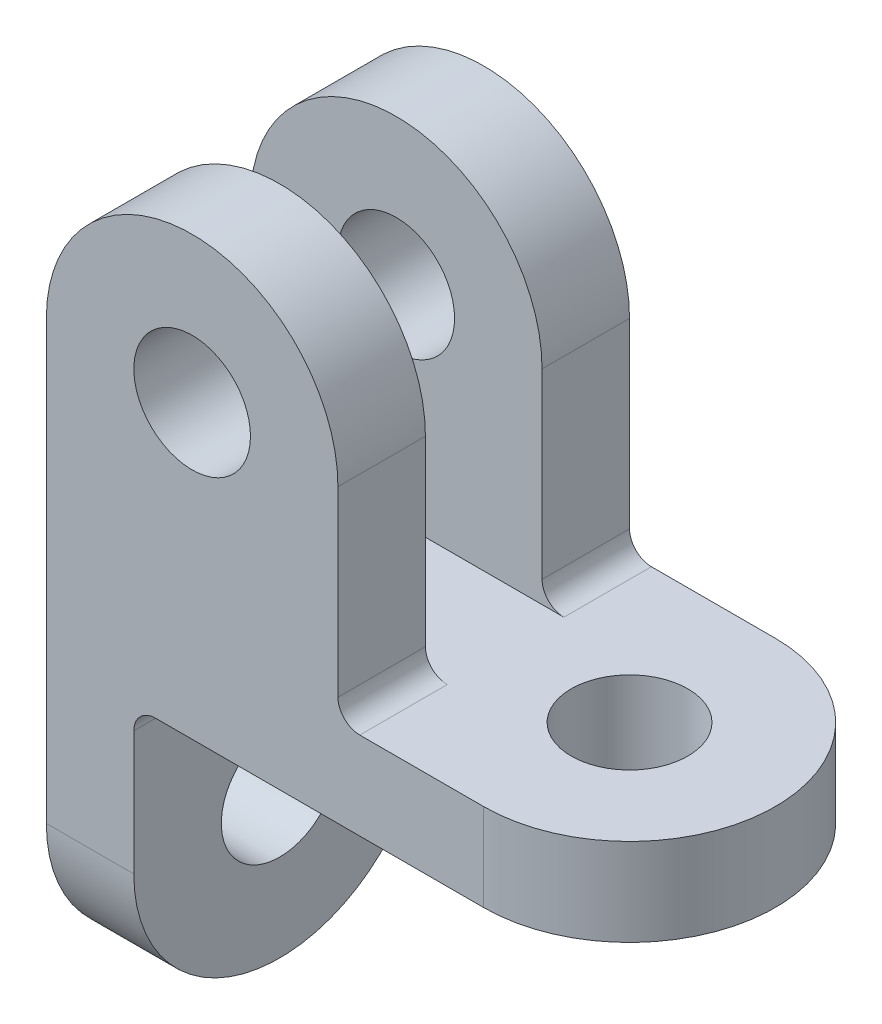
ISO-10303-21;
HEADER;
FILE_DESCRIPTION(('STEP AP214'),'2;1');
FILE_NAME('part.step','',(''),(''),'','','');
FILE_SCHEMA(('AUTOMOTIVE_DESIGN { 1 0 10303 214 1 1 1 1 }'));
ENDSEC;
DATA;
#1=APPLICATION_CONTEXT('core data for automotive mechanical design processes');
#2=APPLICATION_PROTOCOL_DEFINITION('international standard','automotive_design',2000,#1);
#3=PRODUCT_CONTEXT('',#1,'mechanical');
#4=PRODUCT('Part','Part','',(#3));
#5=PRODUCT_RELATED_PRODUCT_CATEGORY('part','',(#4));
#6=PRODUCT_DEFINITION_FORMATION('','',#4);
#7=PRODUCT_DEFINITION_CONTEXT('part definition',#1,'design');
#8=PRODUCT_DEFINITION('design','',#6,#7);
#9=PRODUCT_DEFINITION_SHAPE('','',#8);
#10=(LENGTH_UNIT() NAMED_UNIT(*) SI_UNIT(.MILLI.,.METRE.));
#11=(NAMED_UNIT(*) PLANE_ANGLE_UNIT() SI_UNIT($,.RADIAN.));
#12=(NAMED_UNIT(*) SI_UNIT($,.STERADIAN.) SOLID_ANGLE_UNIT());
#13=UNCERTAINTY_MEASURE_WITH_UNIT(LENGTH_MEASURE(1.E-05),#10,'distance_accuracy_value','');
#14=(GEOMETRIC_REPRESENTATION_CONTEXT(3) GLOBAL_UNCERTAINTY_ASSIGNED_CONTEXT((#13)) GLOBAL_UNIT_ASSIGNED_CONTEXT((#10,
#11,#12)) REPRESENTATION_CONTEXT('',''));
#15=CARTESIAN_POINT('',(0.,0.,0.));
#16=DIRECTION('',(0.,0.,1.));
#17=DIRECTION('',(1.,0.,0.));
#18=AXIS2_PLACEMENT_3D('',#15,#16,#17);
#19=CARTESIAN_POINT('',(-6.52307692307691,12.,40.));
#20=DIRECTION('',(-1.,0.,0.));
#21=DIRECTION('',(0.,-1.,0.));
#22=AXIS2_PLACEMENT_3D('',#19,#20,#21);
#23=PLANE('',#22);
#24=DIRECTION('',(0.,1.,0.));
#25=VECTOR('',#24,1.);
#26=CARTESIAN_POINT('',(-6.52307692307691,12.,40.));
#27=LINE('',#26,#25);
#28=CARTESIAN_POINT('',(-6.52307692307691,15.,40.));
#29=VERTEX_POINT('',#28);
#30=CARTESIAN_POINT('',(-6.52307692307692,40.,40.));
#31=VERTEX_POINT('',#30);
#32=EDGE_CURVE('E223',#29,#31,#27,.T.);
#33=ORIENTED_EDGE('',*,*,#32,.F.);
#34=DIRECTION('',(0.,0.,-1.));
#35=VECTOR('',#34,1.);
#36=CARTESIAN_POINT('',(-6.52307692307691,15.,28.));
#37=LINE('',#36,#35);
#38=CARTESIAN_POINT('',(-6.52307692307691,15.,28.));
#39=VERTEX_POINT('',#38);
#40=EDGE_CURVE('E263',#29,#39,#37,.T.);
#41=ORIENTED_EDGE('',*,*,#40,.T.);
#42=DIRECTION('',(0.,-1.,0.));
#43=VECTOR('',#42,1.);
#44=CARTESIAN_POINT('',(-6.52307692307691,12.,28.));
#45=LINE('',#44,#43);
#46=CARTESIAN_POINT('',(-6.52307692307692,40.,28.));
#47=VERTEX_POINT('',#46);
#48=EDGE_CURVE('E276',#47,#39,#45,.T.);
#49=ORIENTED_EDGE('',*,*,#48,.F.);
#50=DIRECTION('',(0.,0.,-1.));
#51=VECTOR('',#50,1.);
#52=CARTESIAN_POINT('',(-6.52307692307692,40.,40.));
#53=LINE('',#52,#51);
#54=EDGE_CURVE('E245',#31,#47,#53,.T.);
#55=ORIENTED_EDGE('',*,*,#54,.F.);
#56=EDGE_LOOP('',(#33,#41,#49,#55));
#57=FACE_BOUND('',#56,.T.);
#58=ADVANCED_FACE('F33',(#57),#23,.F.);
#59=CARTESIAN_POINT('',(-26.5230769230769,40.,0.));
#60=DIRECTION('',(0.,0.,1.));
#61=DIRECTION('',(1.,0.,0.));
#62=AXIS2_PLACEMENT_3D('',#59,#60,#61);
#63=CYLINDRICAL_SURFACE('',#62,20.);
#64=CARTESIAN_POINT('',(-26.5230769230769,40.,28.));
#65=DIRECTION('',(0.,0.,1.));
#66=DIRECTION('',(1.,0.,0.));
#67=AXIS2_PLACEMENT_3D('',#64,#65,#66);
#68=CIRCLE('',#67,20.);
#69=CARTESIAN_POINT('',(-46.5230769230769,40.,28.));
#70=VERTEX_POINT('',#69);
#71=EDGE_CURVE('E172',#70,#47,#68,.F.);
#72=ORIENTED_EDGE('',*,*,#71,.F.);
#73=DIRECTION('',(0.,0.,-1.));
#74=VECTOR('',#73,1.);
#75=CARTESIAN_POINT('',(-46.5230769230769,40.,40.));
#76=LINE('',#75,#74);
#77=CARTESIAN_POINT('',(-46.5230769230769,40.,40.));
#78=VERTEX_POINT('',#77);
#79=EDGE_CURVE('E242',#78,#70,#76,.T.);
#80=ORIENTED_EDGE('',*,*,#79,.F.);
#81=CARTESIAN_POINT('',(-26.5230769230769,40.,40.));
#82=DIRECTION('',(0.,0.,1.));
#83=DIRECTION('',(1.,0.,0.));
#84=AXIS2_PLACEMENT_3D('',#81,#82,#83);
#85=CIRCLE('',#84,20.);
#86=EDGE_CURVE('E177',#31,#78,#85,.T.);
#87=ORIENTED_EDGE('',*,*,#86,.F.);
#88=ORIENTED_EDGE('',*,*,#54,.T.);
#89=EDGE_LOOP('',(#72,#80,#87,#88));
#90=FACE_BOUND('',#89,.T.);
#91=ADVANCED_FACE('F313',(#90),#63,.T.);
#92=CARTESIAN_POINT('',(-26.5230769230769,40.,0.));
#93=DIRECTION('',(0.,0.,1.));
#94=DIRECTION('',(1.,0.,0.));
#95=AXIS2_PLACEMENT_3D('',#92,#93,#94);
#96=CYLINDRICAL_SURFACE('',#95,8.);
#97=CARTESIAN_POINT('',(-26.5230769230769,40.,28.));
#98=DIRECTION('',(0.,0.,1.));
#99=DIRECTION('',(1.,0.,0.));
#100=AXIS2_PLACEMENT_3D('',#97,#98,#99);
#101=CIRCLE('',#100,8.);
#102=CARTESIAN_POINT('',(-18.5230769230769,40.,28.));
#103=VERTEX_POINT('',#102);
#104=EDGE_CURVE('E149',#103,#103,#101,.F.);
#105=ORIENTED_EDGE('',*,*,#104,.T.);
#106=EDGE_LOOP('',(#105));
#107=FACE_BOUND('',#106,.T.);
#108=CARTESIAN_POINT('',(-26.5230769230769,40.,40.));
#109=DIRECTION('',(0.,0.,1.));
#110=DIRECTION('',(1.,0.,0.));
#111=AXIS2_PLACEMENT_3D('',#108,#109,#110);
#112=CIRCLE('',#111,8.);
#113=CARTESIAN_POINT('',(-18.5230769230769,40.,40.));
#114=VERTEX_POINT('',#113);
#115=EDGE_CURVE('E167',#114,#114,#112,.T.);
#116=ORIENTED_EDGE('',*,*,#115,.T.);
#117=EDGE_LOOP('',(#116));
#118=FACE_BOUND('',#117,.T.);
#119=ADVANCED_FACE('F333',(#107,#118),#96,.F.);
#120=CARTESIAN_POINT('',(-46.5230769230769,40.,40.));
#121=DIRECTION('',(1.,0.,0.));
#122=DIRECTION('',(0.,0.,-1.));
#123=AXIS2_PLACEMENT_3D('',#120,#121,#122);
#124=PLANE('',#123);
#125=ORIENTED_EDGE('',*,*,#79,.T.);
#126=DIRECTION('',(0.,-1.,0.));
#127=VECTOR('',#126,1.);
#128=CARTESIAN_POINT('',(-46.5230769230769,40.,28.));
#129=LINE('',#128,#127);
#130=CARTESIAN_POINT('',(-46.5230769230769,12.,28.));
#131=VERTEX_POINT('',#130);
#132=EDGE_CURVE('E166',#70,#131,#129,.T.);
#133=ORIENTED_EDGE('',*,*,#132,.T.);
#134=DIRECTION('',(0.,0.,-1.));
#135=VECTOR('',#134,1.);
#136=CARTESIAN_POINT('',(-46.5230769230769,12.,40.));
#137=LINE('',#136,#135);
#138=CARTESIAN_POINT('',(-46.5230769230769,12.,12.));
#139=VERTEX_POINT('',#138);
#140=EDGE_CURVE('E154',#131,#139,#137,.T.);
#141=ORIENTED_EDGE('',*,*,#140,.T.);
#142=DIRECTION('',(0.,1.,0.));
#143=VECTOR('',#142,1.);
#144=CARTESIAN_POINT('',(-46.5230769230769,40.,12.));
#145=LINE('',#144,#143);
#146=CARTESIAN_POINT('',(-46.5230769230769,40.,12.));
#147=VERTEX_POINT('',#146);
#148=EDGE_CURVE('E139',#139,#147,#145,.T.);
#149=ORIENTED_EDGE('',*,*,#148,.T.);
#150=CARTESIAN_POINT('',(-46.5230769230769,40.,0.));
#151=VERTEX_POINT('',#150);
#152=EDGE_CURVE('E225',#147,#151,#76,.T.);
#153=ORIENTED_EDGE('',*,*,#152,.T.);
#154=DIRECTION('',(0.,-1.,0.));
#155=VECTOR('',#154,1.);
#156=CARTESIAN_POINT('',(-46.5230769230769,40.,0.));
#157=LINE('',#156,#155);
#158=CARTESIAN_POINT('',(-46.5230769230769,-20.,0.));
#159=VERTEX_POINT('',#158);
#160=EDGE_CURVE('E206',#151,#159,#157,.T.);
#161=ORIENTED_EDGE('',*,*,#160,.T.);
#162=CARTESIAN_POINT('',(-46.5230769230769,-20.,20.));
#163=DIRECTION('',(1.,0.,0.));
#164=DIRECTION('',(0.,0.,-1.));
#165=AXIS2_PLACEMENT_3D('',#162,#163,#164);
#166=CIRCLE('',#165,20.);
#167=CARTESIAN_POINT('',(-46.5230769230769,-20.,40.));
#168=VERTEX_POINT('',#167);
#169=EDGE_CURVE('E203',#168,#159,#166,.T.);
#170=ORIENTED_EDGE('',*,*,#169,.F.);
#171=DIRECTION('',(0.,-1.,0.));
#172=VECTOR('',#171,1.);
#173=CARTESIAN_POINT('',(-46.5230769230769,40.,40.));
#174=LINE('',#173,#172);
#175=EDGE_CURVE('E209',#78,#168,#174,.T.);
#176=ORIENTED_EDGE('',*,*,#175,.F.);
#177=EDGE_LOOP('',(#125,#133,#141,#149,#153,#161,#170,#176));
#178=FACE_BOUND('',#177,.T.);
#179=CARTESIAN_POINT('',(-46.5230769230769,-20.,20.));
#180=DIRECTION('',(1.,0.,0.));
#181=DIRECTION('',(0.,0.,-1.));
#182=AXIS2_PLACEMENT_3D('',#179,#180,#181);
#183=CIRCLE('',#182,8.);
#184=CARTESIAN_POINT('',(-46.5230769230769,-20.,12.));
#185=VERTEX_POINT('',#184);
#186=EDGE_CURVE('E199',#185,#185,#183,.F.);
#187=ORIENTED_EDGE('',*,*,#186,.F.);
#188=EDGE_LOOP('',(#187));
#189=FACE_BOUND('',#188,.T.);
#190=ADVANCED_FACE('F164',(#178,#189),#124,.F.);
#191=CARTESIAN_POINT('',(-34.5230769230769,-20.,40.));
#192=DIRECTION('',(-1.,0.,0.));
#193=DIRECTION('',(0.,0.,1.));
#194=AXIS2_PLACEMENT_3D('',#191,#192,#193);
#195=PLANE('',#194);
#196=CARTESIAN_POINT('',(-34.5230769230769,-20.,20.));
#197=DIRECTION('',(1.,0.,0.));
#198=DIRECTION('',(0.,0.,-1.));
#199=AXIS2_PLACEMENT_3D('',#196,#197,#198);
#200=CIRCLE('',#199,8.);
#201=CARTESIAN_POINT('',(-34.5230769230769,-20.,12.));
#202=VERTEX_POINT('',#201);
#203=EDGE_CURVE('E194',#202,#202,#200,.T.);
#204=ORIENTED_EDGE('',*,*,#203,.F.);
#205=EDGE_LOOP('',(#204));
#206=FACE_BOUND('',#205,.T.);
#207=DIRECTION('',(0.,1.,0.));
#208=VECTOR('',#207,1.);
#209=CARTESIAN_POINT('',(-34.5230769230769,-20.,0.));
#210=LINE('',#209,#208);
#211=CARTESIAN_POINT('',(-34.5230769230769,-20.,0.));
#212=VERTEX_POINT('',#211);
#213=CARTESIAN_POINT('',(-34.5230769230769,-3.00000000000001,0.));
#214=VERTEX_POINT('',#213);
#215=EDGE_CURVE('E231',#212,#214,#210,.T.);
#216=ORIENTED_EDGE('',*,*,#215,.T.);
#217=DIRECTION('',(0.,0.,-1.));
#218=VECTOR('',#217,1.);
#219=CARTESIAN_POINT('',(-34.5230769230769,-3.,40.));
#220=LINE('',#219,#218);
#221=CARTESIAN_POINT('',(-34.5230769230769,-3.00000000000001,40.));
#222=VERTEX_POINT('',#221);
#223=EDGE_CURVE('E255',#214,#222,#220,.F.);
#224=ORIENTED_EDGE('',*,*,#223,.T.);
#225=DIRECTION('',(0.,1.,0.));
#226=VECTOR('',#225,1.);
#227=CARTESIAN_POINT('',(-34.5230769230769,-20.,40.));
#228=LINE('',#227,#226);
#229=CARTESIAN_POINT('',(-34.5230769230769,-20.,40.));
#230=VERTEX_POINT('',#229);
#231=EDGE_CURVE('E214',#230,#222,#228,.T.);
#232=ORIENTED_EDGE('',*,*,#231,.F.);
#233=CARTESIAN_POINT('',(-34.5230769230769,-20.,20.));
#234=DIRECTION('',(1.,0.,0.));
#235=DIRECTION('',(0.,0.,-1.));
#236=AXIS2_PLACEMENT_3D('',#233,#234,#235);
#237=CIRCLE('',#236,20.);
#238=EDGE_CURVE('E202',#230,#212,#237,.T.);
#239=ORIENTED_EDGE('',*,*,#238,.T.);
#240=EDGE_LOOP('',(#216,#224,#232,#239));
#241=FACE_BOUND('',#240,.T.);
#242=ADVANCED_FACE('F354',(#206,#241),#195,.F.);
#243=CARTESIAN_POINT('',(-34.5230769230769,0.,40.));
#244=DIRECTION('',(0.,1.,0.));
#245=DIRECTION('',(0.,0.,1.));
#246=AXIS2_PLACEMENT_3D('',#243,#244,#245);
#247=PLANE('',#246);
#248=CARTESIAN_POINT('',(13.4769230769231,0.,20.));
#249=DIRECTION('',(0.,1.,0.));
#250=DIRECTION('',(-1.,0.,0.));
#251=AXIS2_PLACEMENT_3D('',#248,#249,#250);
#252=CIRCLE('',#251,8.);
#253=CARTESIAN_POINT('',(5.47692307692308,0.,20.));
#254=VERTEX_POINT('',#253);
#255=EDGE_CURVE('E185',#254,#254,#252,.T.);
#256=ORIENTED_EDGE('',*,*,#255,.T.);
#257=EDGE_LOOP('',(#256));
#258=FACE_BOUND('',#257,.T.);
#259=DIRECTION('',(1.,0.,0.));
#260=VECTOR('',#259,1.);
#261=CARTESIAN_POINT('',(-34.5230769230769,0.,40.));
#262=LINE('',#261,#260);
#263=CARTESIAN_POINT('',(-31.5230769230769,0.,40.));
#264=VERTEX_POINT('',#263);
#265=CARTESIAN_POINT('',(13.4769230769231,0.,40.));
#266=VERTEX_POINT('',#265);
#267=EDGE_CURVE('E217',#264,#266,#262,.T.);
#268=ORIENTED_EDGE('',*,*,#267,.F.);
#269=DIRECTION('',(0.,0.,-1.));
#270=VECTOR('',#269,1.);
#271=CARTESIAN_POINT('',(-31.5230769230769,0.,0.));
#272=LINE('',#271,#270);
#273=CARTESIAN_POINT('',(-31.5230769230769,0.,0.));
#274=VERTEX_POINT('',#273);
#275=EDGE_CURVE('E248',#264,#274,#272,.T.);
#276=ORIENTED_EDGE('',*,*,#275,.T.);
#277=DIRECTION('',(1.,0.,0.));
#278=VECTOR('',#277,1.);
#279=CARTESIAN_POINT('',(-34.5230769230769,0.,0.));
#280=LINE('',#279,#278);
#281=CARTESIAN_POINT('',(13.4769230769231,0.,0.));
#282=VERTEX_POINT('',#281);
#283=EDGE_CURVE('E234',#274,#282,#280,.T.);
#284=ORIENTED_EDGE('',*,*,#283,.T.);
#285=CARTESIAN_POINT('',(13.4769230769231,0.,20.));
#286=DIRECTION('',(0.,1.,0.));
#287=DIRECTION('',(-1.,0.,0.));
#288=AXIS2_PLACEMENT_3D('',#285,#286,#287);
#289=CIRCLE('',#288,20.);
#290=EDGE_CURVE('E191',#266,#282,#289,.T.);
#291=ORIENTED_EDGE('',*,*,#290,.F.);
#292=EDGE_LOOP('',(#268,#276,#284,#291));
#293=FACE_BOUND('',#292,.T.);
#294=ADVANCED_FACE('F286',(#258,#293),#247,.F.);
#295=CARTESIAN_POINT('',(13.4769230769231,12.,40.));
#296=DIRECTION('',(0.,-1.,0.));
#297=DIRECTION('',(1.,0.,0.));
#298=AXIS2_PLACEMENT_3D('',#295,#296,#297);
#299=PLANE('',#298);
#300=CARTESIAN_POINT('',(13.4769230769231,12.,20.));
#301=DIRECTION('',(0.,1.,0.));
#302=DIRECTION('',(-1.,0.,0.));
#303=AXIS2_PLACEMENT_3D('',#300,#301,#302);
#304=CIRCLE('',#303,8.);
#305=CARTESIAN_POINT('',(5.47692307692308,12.,20.));
#306=VERTEX_POINT('',#305);
#307=EDGE_CURVE('E182',#306,#306,#304,.T.);
#308=ORIENTED_EDGE('',*,*,#307,.F.);
#309=EDGE_LOOP('',(#308));
#310=FACE_BOUND('',#309,.T.);
#311=DIRECTION('',(-1.,0.,0.));
#312=VECTOR('',#311,1.);
#313=CARTESIAN_POINT('',(13.4769230769231,12.,0.));
#314=LINE('',#313,#312);
#315=CARTESIAN_POINT('',(13.4769230769231,12.,0.));
#316=VERTEX_POINT('',#315);
#317=CARTESIAN_POINT('',(-3.52307692307691,12.,0.));
#318=VERTEX_POINT('',#317);
#319=EDGE_CURVE('E239',#316,#318,#314,.T.);
#320=ORIENTED_EDGE('',*,*,#319,.T.);
#321=DIRECTION('',(0.,0.,-1.));
#322=VECTOR('',#321,1.);
#323=CARTESIAN_POINT('',(-3.52307692307691,12.,12.));
#324=LINE('',#323,#322);
#325=CARTESIAN_POINT('',(-3.52307692307692,12.,12.));
#326=VERTEX_POINT('',#325);
#327=EDGE_CURVE('E157',#318,#326,#324,.F.);
#328=ORIENTED_EDGE('',*,*,#327,.T.);
#329=DIRECTION('',(1.,0.,0.));
#330=VECTOR('',#329,1.);
#331=CARTESIAN_POINT('',(-68.5230769230769,12.,12.));
#332=LINE('',#331,#330);
#333=EDGE_CURVE('E142',#139,#326,#332,.T.);
#334=ORIENTED_EDGE('',*,*,#333,.F.);
#335=ORIENTED_EDGE('',*,*,#140,.F.);
#336=DIRECTION('',(1.,0.,0.));
#337=VECTOR('',#336,1.);
#338=CARTESIAN_POINT('',(-68.5230769230769,12.,28.));
#339=LINE('',#338,#337);
#340=CARTESIAN_POINT('',(-3.52307692307691,12.,28.));
#341=VERTEX_POINT('',#340);
#342=EDGE_CURVE('E160',#131,#341,#339,.T.);
#343=ORIENTED_EDGE('',*,*,#342,.T.);
#344=DIRECTION('',(0.,0.,-1.));
#345=VECTOR('',#344,1.);
#346=CARTESIAN_POINT('',(-3.52307692307691,12.,40.));
#347=LINE('',#346,#345);
#348=CARTESIAN_POINT('',(-3.52307692307691,12.,40.));
#349=VERTEX_POINT('',#348);
#350=EDGE_CURVE('E260',#341,#349,#347,.F.);
#351=ORIENTED_EDGE('',*,*,#350,.T.);
#352=DIRECTION('',(-1.,0.,0.));
#353=VECTOR('',#352,1.);
#354=CARTESIAN_POINT('',(13.4769230769231,12.,40.));
#355=LINE('',#354,#353);
#356=CARTESIAN_POINT('',(13.4769230769231,12.,40.));
#357=VERTEX_POINT('',#356);
#358=EDGE_CURVE('E221',#357,#349,#355,.T.);
#359=ORIENTED_EDGE('',*,*,#358,.F.);
#360=CARTESIAN_POINT('',(13.4769230769231,12.,20.));
#361=DIRECTION('',(0.,1.,0.));
#362=DIRECTION('',(-1.,0.,0.));
#363=AXIS2_PLACEMENT_3D('',#360,#361,#362);
#364=CIRCLE('',#363,20.);
#365=EDGE_CURVE('E188',#357,#316,#364,.T.);
#366=ORIENTED_EDGE('',*,*,#365,.T.);
#367=EDGE_LOOP('',(#320,#328,#334,#335,#343,#351,#359,#366));
#368=FACE_BOUND('',#367,.T.);
#369=ADVANCED_FACE('F153',(#310,#368),#299,.F.);
#370=DIRECTION('',(0.,1.,0.));
#371=VECTOR('',#370,1.);
#372=CARTESIAN_POINT('',(-6.52307692307691,12.,12.));
#373=LINE('',#372,#371);
#374=CARTESIAN_POINT('',(-6.52307692307691,15.,12.));
#375=VERTEX_POINT('',#374);
#376=CARTESIAN_POINT('',(-6.52307692307692,40.,12.));
#377=VERTEX_POINT('',#376);
#378=EDGE_CURVE('E297',#375,#377,#373,.T.);
#379=ORIENTED_EDGE('',*,*,#378,.F.);
#380=DIRECTION('',(0.,0.,-1.));
#381=VECTOR('',#380,1.);
#382=CARTESIAN_POINT('',(-6.52307692307691,15.,0.));
#383=LINE('',#382,#381);
#384=CARTESIAN_POINT('',(-6.52307692307691,15.,0.));
#385=VERTEX_POINT('',#384);
#386=EDGE_CURVE('E257',#375,#385,#383,.T.);
#387=ORIENTED_EDGE('',*,*,#386,.T.);
#388=DIRECTION('',(0.,1.,0.));
#389=VECTOR('',#388,1.);
#390=CARTESIAN_POINT('',(-6.52307692307691,12.,0.));
#391=LINE('',#390,#389);
#392=CARTESIAN_POINT('',(-6.52307692307692,40.,0.));
#393=VERTEX_POINT('',#392);
#394=EDGE_CURVE('E212',#385,#393,#391,.T.);
#395=ORIENTED_EDGE('',*,*,#394,.T.);
#396=EDGE_CURVE('E244',#377,#393,#53,.T.);
#397=ORIENTED_EDGE('',*,*,#396,.F.);
#398=EDGE_LOOP('',(#379,#387,#395,#397));
#399=FACE_BOUND('',#398,.T.);
#400=ADVANCED_FACE('F300',(#399),#23,.F.);
#401=CARTESIAN_POINT('',(0.,0.,40.));
#402=DIRECTION('',(0.,0.,1.));
#403=DIRECTION('',(1.,0.,0.));
#404=AXIS2_PLACEMENT_3D('',#401,#402,#403);
#405=PLANE('',#404);
#406=ORIENTED_EDGE('',*,*,#115,.F.);
#407=EDGE_LOOP('',(#406));
#408=FACE_BOUND('',#407,.T.);
#409=ORIENTED_EDGE('',*,*,#175,.T.);
#410=DIRECTION('',(1.,0.,0.));
#411=VECTOR('',#410,1.);
#412=CARTESIAN_POINT('',(-46.5230769230769,-20.,40.));
#413=LINE('',#412,#411);
#414=EDGE_CURVE('E211',#168,#230,#413,.T.);
#415=ORIENTED_EDGE('',*,*,#414,.T.);
#416=ORIENTED_EDGE('',*,*,#231,.T.);
#417=CARTESIAN_POINT('',(-31.5230769230769,-3.,40.));
#418=DIRECTION('',(0.,0.,1.));
#419=DIRECTION('',(1.,0.,0.));
#420=AXIS2_PLACEMENT_3D('',#417,#418,#419);
#421=CIRCLE('',#420,3.);
#422=EDGE_CURVE('E267',#222,#264,#421,.F.);
#423=ORIENTED_EDGE('',*,*,#422,.T.);
#424=ORIENTED_EDGE('',*,*,#267,.T.);
#425=DIRECTION('',(0.,1.,0.));
#426=VECTOR('',#425,1.);
#427=CARTESIAN_POINT('',(13.4769230769231,0.,40.));
#428=LINE('',#427,#426);
#429=EDGE_CURVE('E219',#266,#357,#428,.T.);
#430=ORIENTED_EDGE('',*,*,#429,.T.);
#431=ORIENTED_EDGE('',*,*,#358,.T.);
#432=CARTESIAN_POINT('',(-3.52307692307691,15.,40.));
#433=DIRECTION('',(0.,0.,1.));
#434=DIRECTION('',(1.,0.,0.));
#435=AXIS2_PLACEMENT_3D('',#432,#433,#434);
#436=CIRCLE('',#435,3.);
#437=EDGE_CURVE('E11',#349,#29,#436,.F.);
#438=ORIENTED_EDGE('',*,*,#437,.T.);
#439=ORIENTED_EDGE('',*,*,#32,.T.);
#440=ORIENTED_EDGE('',*,*,#86,.T.);
#441=EDGE_LOOP('',(#409,#415,#416,#423,#424,#430,#431,#438,#439,#440));
#442=FACE_BOUND('',#441,.T.);
#443=ADVANCED_FACE('F279',(#408,#442),#405,.T.);
#444=CARTESIAN_POINT('',(0.,0.,0.));
#445=DIRECTION('',(0.,0.,1.));
#446=DIRECTION('',(1.,0.,0.));
#447=AXIS2_PLACEMENT_3D('',#444,#445,#446);
#448=PLANE('',#447);
#449=CARTESIAN_POINT('',(-26.5230769230769,40.,0.));
#450=DIRECTION('',(0.,0.,1.));
#451=DIRECTION('',(1.,0.,0.));
#452=AXIS2_PLACEMENT_3D('',#449,#450,#451);
#453=CIRCLE('',#452,8.);
#454=CARTESIAN_POINT('',(-18.5230769230769,40.,0.));
#455=VERTEX_POINT('',#454);
#456=EDGE_CURVE('E170',#455,#455,#453,.T.);
#457=ORIENTED_EDGE('',*,*,#456,.T.);
#458=EDGE_LOOP('',(#457));
#459=FACE_BOUND('',#458,.T.);
#460=ORIENTED_EDGE('',*,*,#160,.F.);
#461=CARTESIAN_POINT('',(-26.5230769230769,40.,0.));
#462=DIRECTION('',(0.,0.,1.));
#463=DIRECTION('',(1.,0.,0.));
#464=AXIS2_PLACEMENT_3D('',#461,#462,#463);
#465=CIRCLE('',#464,20.);
#466=EDGE_CURVE('E179',#393,#151,#465,.T.);
#467=ORIENTED_EDGE('',*,*,#466,.F.);
#468=ORIENTED_EDGE('',*,*,#394,.F.);
#469=CARTESIAN_POINT('',(-3.52307692307691,15.,0.));
#470=DIRECTION('',(0.,0.,1.));
#471=DIRECTION('',(1.,0.,0.));
#472=AXIS2_PLACEMENT_3D('',#469,#470,#471);
#473=CIRCLE('',#472,3.);
#474=EDGE_CURVE('E269',#385,#318,#473,.T.);
#475=ORIENTED_EDGE('',*,*,#474,.T.);
#476=ORIENTED_EDGE('',*,*,#319,.F.);
#477=DIRECTION('',(0.,1.,0.));
#478=VECTOR('',#477,1.);
#479=CARTESIAN_POINT('',(13.4769230769231,0.,0.));
#480=LINE('',#479,#478);
#481=EDGE_CURVE('E236',#282,#316,#480,.T.);
#482=ORIENTED_EDGE('',*,*,#481,.F.);
#483=ORIENTED_EDGE('',*,*,#283,.F.);
#484=CARTESIAN_POINT('',(-31.5230769230769,-3.,0.));
#485=DIRECTION('',(0.,0.,1.));
#486=DIRECTION('',(1.,0.,0.));
#487=AXIS2_PLACEMENT_3D('',#484,#485,#486);
#488=CIRCLE('',#487,3.);
#489=EDGE_CURVE('E265',#274,#214,#488,.T.);
#490=ORIENTED_EDGE('',*,*,#489,.T.);
#491=ORIENTED_EDGE('',*,*,#215,.F.);
#492=DIRECTION('',(1.,0.,0.));
#493=VECTOR('',#492,1.);
#494=CARTESIAN_POINT('',(-46.5230769230769,-20.,0.));
#495=LINE('',#494,#493);
#496=EDGE_CURVE('E228',#159,#212,#495,.T.);
#497=ORIENTED_EDGE('',*,*,#496,.F.);
#498=EDGE_LOOP('',(#460,#467,#468,#475,#476,#482,#483,#490,#491,#497));
#499=FACE_BOUND('',#498,.T.);
#500=ADVANCED_FACE('F292',(#459,#499),#448,.F.);
#501=CARTESIAN_POINT('',(-46.5230769230769,-20.,20.));
#502=DIRECTION('',(1.,0.,0.));
#503=DIRECTION('',(0.,0.,-1.));
#504=AXIS2_PLACEMENT_3D('',#501,#502,#503);
#505=CYLINDRICAL_SURFACE('',#504,20.);
#506=ORIENTED_EDGE('',*,*,#238,.F.);
#507=ORIENTED_EDGE('',*,*,#414,.F.);
#508=ORIENTED_EDGE('',*,*,#169,.T.);
#509=ORIENTED_EDGE('',*,*,#496,.T.);
#510=EDGE_LOOP('',(#506,#507,#508,#509));
#511=FACE_BOUND('',#510,.T.);
#512=ADVANCED_FACE('F319',(#511),#505,.T.);
#513=CARTESIAN_POINT('',(-69.1504939210464,-20.,20.));
#514=DIRECTION('',(1.,0.,0.));
#515=DIRECTION('',(0.,0.,-1.));
#516=AXIS2_PLACEMENT_3D('',#513,#514,#515);
#517=CYLINDRICAL_SURFACE('',#516,8.);
#518=ORIENTED_EDGE('',*,*,#186,.T.);
#519=EDGE_LOOP('',(#518));
#520=FACE_BOUND('',#519,.T.);
#521=ORIENTED_EDGE('',*,*,#203,.T.);
#522=EDGE_LOOP('',(#521));
#523=FACE_BOUND('',#522,.T.);
#524=ADVANCED_FACE('F494',(#520,#523),#517,.F.);
#525=CARTESIAN_POINT('',(13.4769230769231,0.,20.));
#526=DIRECTION('',(0.,1.,0.));
#527=DIRECTION('',(-1.,0.,0.));
#528=AXIS2_PLACEMENT_3D('',#525,#526,#527);
#529=CYLINDRICAL_SURFACE('',#528,20.);
#530=ORIENTED_EDGE('',*,*,#365,.F.);
#531=ORIENTED_EDGE('',*,*,#429,.F.);
#532=ORIENTED_EDGE('',*,*,#290,.T.);
#533=ORIENTED_EDGE('',*,*,#481,.T.);
#534=EDGE_LOOP('',(#530,#531,#532,#533));
#535=FACE_BOUND('',#534,.T.);
#536=ADVANCED_FACE('F284',(#535),#529,.T.);
#537=CARTESIAN_POINT('',(13.4769230769231,0.,20.));
#538=DIRECTION('',(0.,1.,0.));
#539=DIRECTION('',(-1.,0.,0.));
#540=AXIS2_PLACEMENT_3D('',#537,#538,#539);
#541=CYLINDRICAL_SURFACE('',#540,8.);
#542=ORIENTED_EDGE('',*,*,#255,.F.);
#543=EDGE_LOOP('',(#542));
#544=FACE_BOUND('',#543,.T.);
#545=ORIENTED_EDGE('',*,*,#307,.T.);
#546=EDGE_LOOP('',(#545));
#547=FACE_BOUND('',#546,.T.);
#548=ADVANCED_FACE('F325',(#544,#547),#541,.F.);
#549=CARTESIAN_POINT('',(-26.5230769230769,40.,12.));
#550=DIRECTION('',(0.,0.,-1.));
#551=DIRECTION('',(0.,1.,0.));
#552=AXIS2_PLACEMENT_3D('',#549,#550,#551);
#553=CIRCLE('',#552,20.);
#554=EDGE_CURVE('E145',#377,#147,#553,.F.);
#555=ORIENTED_EDGE('',*,*,#554,.F.);
#556=ORIENTED_EDGE('',*,*,#396,.T.);
#557=ORIENTED_EDGE('',*,*,#466,.T.);
#558=ORIENTED_EDGE('',*,*,#152,.F.);
#559=EDGE_LOOP('',(#555,#556,#557,#558));
#560=FACE_BOUND('',#559,.T.);
#561=ADVANCED_FACE('F322',(#560),#63,.T.);
#562=CARTESIAN_POINT('',(-26.5230769230769,40.,12.));
#563=DIRECTION('',(0.,0.,-1.));
#564=DIRECTION('',(0.,1.,0.));
#565=AXIS2_PLACEMENT_3D('',#562,#563,#564);
#566=CIRCLE('',#565,8.);
#567=CARTESIAN_POINT('',(-26.5230769230769,48.,12.));
#568=VERTEX_POINT('',#567);
#569=EDGE_CURVE('E159',#568,#568,#566,.F.);
#570=ORIENTED_EDGE('',*,*,#569,.T.);
#571=EDGE_LOOP('',(#570));
#572=FACE_BOUND('',#571,.T.);
#573=ORIENTED_EDGE('',*,*,#456,.F.);
#574=EDGE_LOOP('',(#573));
#575=FACE_BOUND('',#574,.T.);
#576=ADVANCED_FACE('F324',(#572,#575),#96,.F.);
#577=CARTESIAN_POINT('',(-68.5230769230769,12.,28.));
#578=DIRECTION('',(0.,0.,1.));
#579=DIRECTION('',(1.,0.,0.));
#580=AXIS2_PLACEMENT_3D('',#577,#578,#579);
#581=PLANE('',#580);
#582=ORIENTED_EDGE('',*,*,#104,.F.);
#583=EDGE_LOOP('',(#582));
#584=FACE_BOUND('',#583,.T.);
#585=ORIENTED_EDGE('',*,*,#71,.T.);
#586=ORIENTED_EDGE('',*,*,#48,.T.);
#587=CARTESIAN_POINT('',(-3.52307692307691,15.,28.));
#588=DIRECTION('',(0.,0.,1.));
#589=DIRECTION('',(1.,0.,0.));
#590=AXIS2_PLACEMENT_3D('',#587,#588,#589);
#591=CIRCLE('',#590,3.);
#592=EDGE_CURVE('E41',#39,#341,#591,.T.);
#593=ORIENTED_EDGE('',*,*,#592,.T.);
#594=ORIENTED_EDGE('',*,*,#342,.F.);
#595=ORIENTED_EDGE('',*,*,#132,.F.);
#596=EDGE_LOOP('',(#585,#586,#593,#594,#595));
#597=FACE_BOUND('',#596,.T.);
#598=ADVANCED_FACE('F274',(#584,#597),#581,.F.);
#599=CARTESIAN_POINT('',(-68.5230769230769,12.,12.));
#600=DIRECTION('',(0.,0.,-1.));
#601=DIRECTION('',(0.,1.,0.));
#602=AXIS2_PLACEMENT_3D('',#599,#600,#601);
#603=PLANE('',#602);
#604=ORIENTED_EDGE('',*,*,#569,.F.);
#605=EDGE_LOOP('',(#604));
#606=FACE_BOUND('',#605,.T.);
#607=ORIENTED_EDGE('',*,*,#333,.T.);
#608=CARTESIAN_POINT('',(-3.52307692307691,15.,12.));
#609=DIRECTION('',(0.,0.,-1.));
#610=DIRECTION('',(0.,1.,0.));
#611=AXIS2_PLACEMENT_3D('',#608,#609,#610);
#612=CIRCLE('',#611,3.);
#613=EDGE_CURVE('E271',#326,#375,#612,.T.);
#614=ORIENTED_EDGE('',*,*,#613,.T.);
#615=ORIENTED_EDGE('',*,*,#378,.T.);
#616=ORIENTED_EDGE('',*,*,#554,.T.);
#617=ORIENTED_EDGE('',*,*,#148,.F.);
#618=EDGE_LOOP('',(#607,#614,#615,#616,#617));
#619=FACE_BOUND('',#618,.T.);
#620=ADVANCED_FACE('F141',(#606,#619),#603,.F.);
#621=CARTESIAN_POINT('',(-31.5230769230769,-3.,40.));
#622=DIRECTION('',(0.,0.,1.));
#623=DIRECTION('',(1.,0.,0.));
#624=AXIS2_PLACEMENT_3D('',#621,#622,#623);
#625=CYLINDRICAL_SURFACE('',#624,3.);
#626=ORIENTED_EDGE('',*,*,#422,.F.);
#627=ORIENTED_EDGE('',*,*,#223,.F.);
#628=ORIENTED_EDGE('',*,*,#489,.F.);
#629=ORIENTED_EDGE('',*,*,#275,.F.);
#630=EDGE_LOOP('',(#626,#627,#628,#629));
#631=FACE_BOUND('',#630,.T.);
#632=ADVANCED_FACE('F364',(#631),#625,.F.);
#633=CARTESIAN_POINT('',(-3.52307692307691,15.,40.));
#634=DIRECTION('',(0.,0.,1.));
#635=DIRECTION('',(1.,0.,0.));
#636=AXIS2_PLACEMENT_3D('',#633,#634,#635);
#637=CYLINDRICAL_SURFACE('',#636,3.);
#638=ORIENTED_EDGE('',*,*,#613,.F.);
#639=ORIENTED_EDGE('',*,*,#327,.F.);
#640=ORIENTED_EDGE('',*,*,#474,.F.);
#641=ORIENTED_EDGE('',*,*,#386,.F.);
#642=EDGE_LOOP('',(#638,#639,#640,#641));
#643=FACE_BOUND('',#642,.T.);
#644=ADVANCED_FACE('F294',(#643),#637,.F.);
#645=CARTESIAN_POINT('',(-3.52307692307691,15.,40.));
#646=DIRECTION('',(0.,0.,1.));
#647=DIRECTION('',(1.,0.,0.));
#648=AXIS2_PLACEMENT_3D('',#645,#646,#647);
#649=CYLINDRICAL_SURFACE('',#648,3.);
#650=ORIENTED_EDGE('',*,*,#437,.F.);
#651=ORIENTED_EDGE('',*,*,#350,.F.);
#652=ORIENTED_EDGE('',*,*,#592,.F.);
#653=ORIENTED_EDGE('',*,*,#40,.F.);
#654=EDGE_LOOP('',(#650,#651,#652,#653));
#655=FACE_BOUND('',#654,.T.);
#656=ADVANCED_FACE('F35',(#655),#649,.F.);
#657=CLOSED_SHELL('',(#58,#91,#119,#190,#242,#294,#369,#400,#443,#500,#512,#524,#536,#548,#561,
#576,#598,#620,#632,#644,#656));
#658=MANIFOLD_SOLID_BREP('B2',#657);
#659=ADVANCED_BREP_SHAPE_REPRESENTATION('',(#18,#658),#14);
#660=SHAPE_DEFINITION_REPRESENTATION(#9,#659);
ENDSEC;
END-ISO-10303-21;
